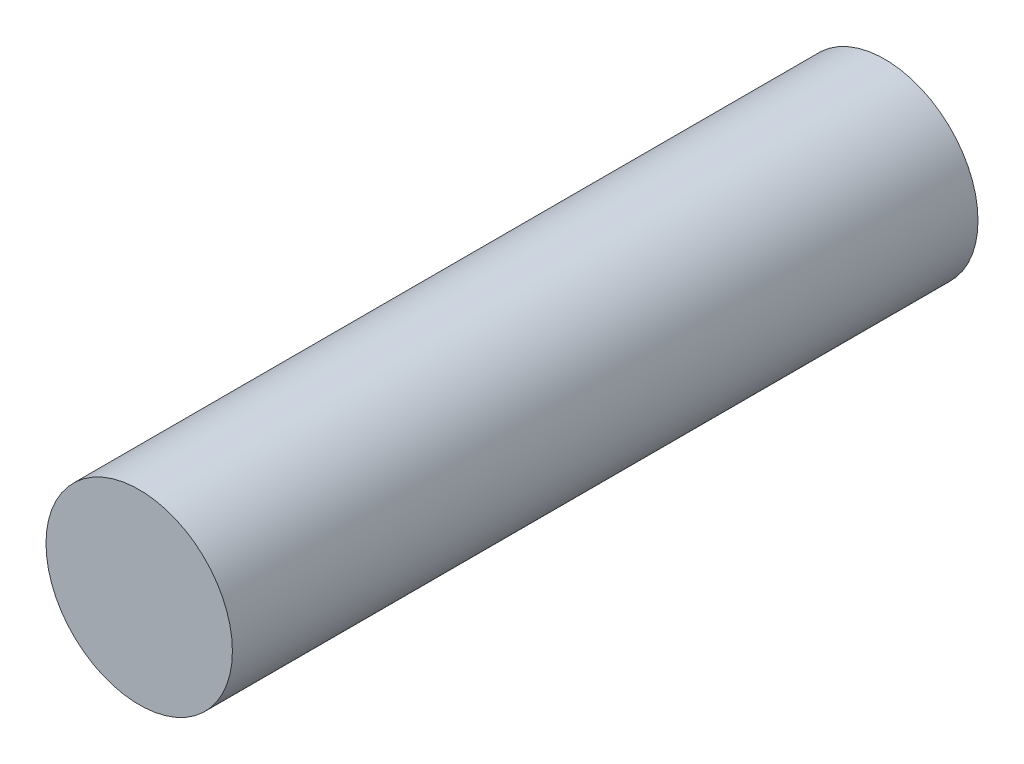
ISO-10303-21;
HEADER;
FILE_DESCRIPTION(('STEP AP214'),'2;1');
FILE_NAME('part.step','',(''),(''),'','','');
FILE_SCHEMA(('AUTOMOTIVE_DESIGN { 1 0 10303 214 1 1 1 1 }'));
ENDSEC;
DATA;
#1=APPLICATION_CONTEXT('core data for automotive mechanical design processes');
#2=APPLICATION_PROTOCOL_DEFINITION('international standard','automotive_design',2000,#1);
#3=PRODUCT_CONTEXT('',#1,'mechanical');
#4=PRODUCT('Part','Part','',(#3));
#5=PRODUCT_RELATED_PRODUCT_CATEGORY('part','',(#4));
#6=PRODUCT_DEFINITION_FORMATION('','',#4);
#7=PRODUCT_DEFINITION_CONTEXT('part definition',#1,'design');
#8=PRODUCT_DEFINITION('design','',#6,#7);
#9=PRODUCT_DEFINITION_SHAPE('','',#8);
#10=(LENGTH_UNIT() NAMED_UNIT(*) SI_UNIT(.MILLI.,.METRE.));
#11=(NAMED_UNIT(*) PLANE_ANGLE_UNIT() SI_UNIT($,.RADIAN.));
#12=(NAMED_UNIT(*) SI_UNIT($,.STERADIAN.) SOLID_ANGLE_UNIT());
#13=UNCERTAINTY_MEASURE_WITH_UNIT(LENGTH_MEASURE(1.E-05),#10,'distance_accuracy_value','');
#14=(GEOMETRIC_REPRESENTATION_CONTEXT(3) GLOBAL_UNCERTAINTY_ASSIGNED_CONTEXT((#13)) GLOBAL_UNIT_ASSIGNED_CONTEXT((#10,
#11,#12)) REPRESENTATION_CONTEXT('',''));
#15=CARTESIAN_POINT('',(0.,0.,0.));
#16=DIRECTION('',(0.,0.,1.));
#17=DIRECTION('',(1.,0.,0.));
#18=AXIS2_PLACEMENT_3D('',#15,#16,#17);
#19=CARTESIAN_POINT('',(0.,0.,304.8));
#20=DIRECTION('',(0.,0.,-1.));
#21=DIRECTION('',(-1.,0.,0.));
#22=AXIS2_PLACEMENT_3D('',#19,#20,#21);
#23=CYLINDRICAL_SURFACE('',#22,38.1);
#24=CARTESIAN_POINT('',(0.,0.,304.8));
#25=DIRECTION('',(0.,0.,1.));
#26=DIRECTION('',(1.,0.,0.));
#27=AXIS2_PLACEMENT_3D('',#24,#25,#26);
#28=CIRCLE('',#27,38.1);
#29=CARTESIAN_POINT('',(-38.1,0.,304.8));
#30=VERTEX_POINT('',#29);
#31=EDGE_CURVE('E10',#30,#30,#28,.T.);
#32=CARTESIAN_POINT('',(0.,0.,0.));
#33=DIRECTION('',(0.,0.,1.));
#34=DIRECTION('',(1.,0.,0.));
#35=AXIS2_PLACEMENT_3D('',#32,#33,#34);
#36=CIRCLE('',#35,38.1);
#37=CARTESIAN_POINT('',(-38.1,0.,0.));
#38=VERTEX_POINT('',#37);
#39=EDGE_CURVE('E46',#38,#38,#36,.T.);
#40=CARTESIAN_POINT('',(-38.1,0.,304.8));
#41=CARTESIAN_POINT('',(-38.1,0.,301.625));
#42=CARTESIAN_POINT('',(-38.1,0.,298.45));
#43=CARTESIAN_POINT('',(-38.1,0.,292.1));
#44=CARTESIAN_POINT('',(-38.1,0.,288.925));
#45=CARTESIAN_POINT('',(-38.1,0.,282.575));
#46=CARTESIAN_POINT('',(-38.1,0.,279.4));
#47=CARTESIAN_POINT('',(-38.1,0.,273.05));
#48=CARTESIAN_POINT('',(-38.1,0.,269.875));
#49=CARTESIAN_POINT('',(-38.1,0.,263.525));
#50=CARTESIAN_POINT('',(-38.1,0.,260.35));
#51=CARTESIAN_POINT('',(-38.1,0.,254.));
#52=CARTESIAN_POINT('',(-38.1,0.,250.825));
#53=CARTESIAN_POINT('',(-38.1,0.,244.475));
#54=CARTESIAN_POINT('',(-38.1,0.,241.3));
#55=CARTESIAN_POINT('',(-38.1,0.,234.95));
#56=CARTESIAN_POINT('',(-38.1,0.,231.775));
#57=CARTESIAN_POINT('',(-38.1,0.,225.425));
#58=CARTESIAN_POINT('',(-38.1,0.,222.25));
#59=CARTESIAN_POINT('',(-38.1,0.,215.9));
#60=CARTESIAN_POINT('',(-38.1,0.,212.725));
#61=CARTESIAN_POINT('',(-38.1,0.,206.375));
#62=CARTESIAN_POINT('',(-38.1,0.,203.2));
#63=CARTESIAN_POINT('',(-38.1,0.,196.85));
#64=CARTESIAN_POINT('',(-38.1,0.,193.675));
#65=CARTESIAN_POINT('',(-38.1,0.,187.325));
#66=CARTESIAN_POINT('',(-38.1,0.,184.15));
#67=CARTESIAN_POINT('',(-38.1,0.,177.8));
#68=CARTESIAN_POINT('',(-38.1,0.,174.625));
#69=CARTESIAN_POINT('',(-38.1,0.,168.275));
#70=CARTESIAN_POINT('',(-38.1,0.,165.1));
#71=CARTESIAN_POINT('',(-38.1,0.,158.75));
#72=CARTESIAN_POINT('',(-38.1,0.,155.575));
#73=CARTESIAN_POINT('',(-38.1,0.,149.225));
#74=CARTESIAN_POINT('',(-38.1,0.,146.05));
#75=CARTESIAN_POINT('',(-38.1,0.,139.7));
#76=CARTESIAN_POINT('',(-38.1,0.,136.525));
#77=CARTESIAN_POINT('',(-38.1,0.,130.175));
#78=CARTESIAN_POINT('',(-38.1,0.,127.));
#79=CARTESIAN_POINT('',(-38.1,0.,120.65));
#80=CARTESIAN_POINT('',(-38.1,0.,117.475));
#81=CARTESIAN_POINT('',(-38.1,0.,111.125));
#82=CARTESIAN_POINT('',(-38.1,0.,107.95));
#83=CARTESIAN_POINT('',(-38.1,0.,101.6));
#84=CARTESIAN_POINT('',(-38.1,0.,98.425));
#85=CARTESIAN_POINT('',(-38.1,0.,92.075));
#86=CARTESIAN_POINT('',(-38.1,0.,88.9));
#87=CARTESIAN_POINT('',(-38.1,0.,82.55));
#88=CARTESIAN_POINT('',(-38.1,0.,79.375));
#89=CARTESIAN_POINT('',(-38.1,0.,73.025));
#90=CARTESIAN_POINT('',(-38.1,0.,69.85));
#91=CARTESIAN_POINT('',(-38.1,0.,63.5));
#92=CARTESIAN_POINT('',(-38.1,0.,60.325));
#93=CARTESIAN_POINT('',(-38.1,0.,53.975));
#94=CARTESIAN_POINT('',(-38.1,0.,50.8));
#95=CARTESIAN_POINT('',(-38.1,0.,44.45));
#96=CARTESIAN_POINT('',(-38.1,0.,41.275));
#97=CARTESIAN_POINT('',(-38.1,0.,34.925));
#98=CARTESIAN_POINT('',(-38.1,0.,31.75));
#99=CARTESIAN_POINT('',(-38.1,0.,25.4));
#100=CARTESIAN_POINT('',(-38.1,0.,22.225));
#101=CARTESIAN_POINT('',(-38.1,0.,15.875));
#102=CARTESIAN_POINT('',(-38.1,0.,12.7));
#103=CARTESIAN_POINT('',(-38.1,0.,6.35));
#104=CARTESIAN_POINT('',(-38.1,0.,3.175));
#105=CARTESIAN_POINT('',(-38.1,0.,0.));
#106=B_SPLINE_CURVE_WITH_KNOTS('',3,(#40,#41,#42,#43,#44,#45,#46,#47,#48,#49,#50,#51,#52,#53,
#54,#55,#56,#57,#58,#59,#60,#61,#62,#63,#64,#65,#66,#67,#68,#69,#70,#71,#72,#73,#74,#75,#76,#77,
#78,#79,#80,#81,#82,#83,#84,#85,#86,#87,#88,#89,#90,#91,#92,#93,#94,#95,#96,#97,#98,#99,#100,
#101,#102,#103,#104,#105),.UNSPECIFIED.,.F.,.F.,(4,2,2,2,2,2,2,2,2,2,2,2,2,2,2,2,2,2,2,2,2,2,2,
2,2,2,2,2,2,2,2,2,4),(0.,9.52500000000001,19.05,28.575,38.1,47.625,57.15,66.675,76.2,
85.7250000000001,95.2500000000001,104.775,114.3,123.825,133.35,142.875,152.4,161.925,171.45,
180.975,190.5,200.025,209.55,219.075,228.6,238.125,247.65,257.175,266.7,276.225,285.75,295.275,
304.8),.UNSPECIFIED.);
#107=EDGE_CURVE('BSEAM43',#30,#38,#106,.T.);
#108=ORIENTED_EDGE('',*,*,#31,.F.);
#109=ORIENTED_EDGE('',*,*,#39,.T.);
#110=ORIENTED_EDGE('',*,*,#107,.T.);
#111=ORIENTED_EDGE('',*,*,#107,.F.);
#112=EDGE_LOOP('',(#108,#110,#109,#111));
#113=FACE_BOUND('',#112,.T.);
#114=ADVANCED_FACE('F43',(#113),#23,.T.);
#115=CARTESIAN_POINT('',(0.,0.,304.8));
#116=DIRECTION('',(0.,0.,1.));
#117=DIRECTION('',(1.,0.,0.));
#118=AXIS2_PLACEMENT_3D('',#115,#116,#117);
#119=PLANE('',#118);
#120=ORIENTED_EDGE('',*,*,#31,.T.);
#121=EDGE_LOOP('',(#120));
#122=FACE_BOUND('',#121,.T.);
#123=ADVANCED_FACE('F60',(#122),#119,.T.);
#124=CARTESIAN_POINT('',(0.,0.,0.));
#125=DIRECTION('',(0.,0.,1.));
#126=DIRECTION('',(1.,0.,0.));
#127=AXIS2_PLACEMENT_3D('',#124,#125,#126);
#128=PLANE('',#127);
#129=ORIENTED_EDGE('',*,*,#39,.F.);
#130=EDGE_LOOP('',(#129));
#131=FACE_BOUND('',#130,.T.);
#132=ADVANCED_FACE('F58',(#131),#128,.F.);
#133=CLOSED_SHELL('',(#114,#123,#132));
#134=MANIFOLD_SOLID_BREP('B2',#133);
#135=ADVANCED_BREP_SHAPE_REPRESENTATION('',(#18,#134),#14);
#136=SHAPE_DEFINITION_REPRESENTATION(#9,#135);
ENDSEC;
END-ISO-10303-21;
